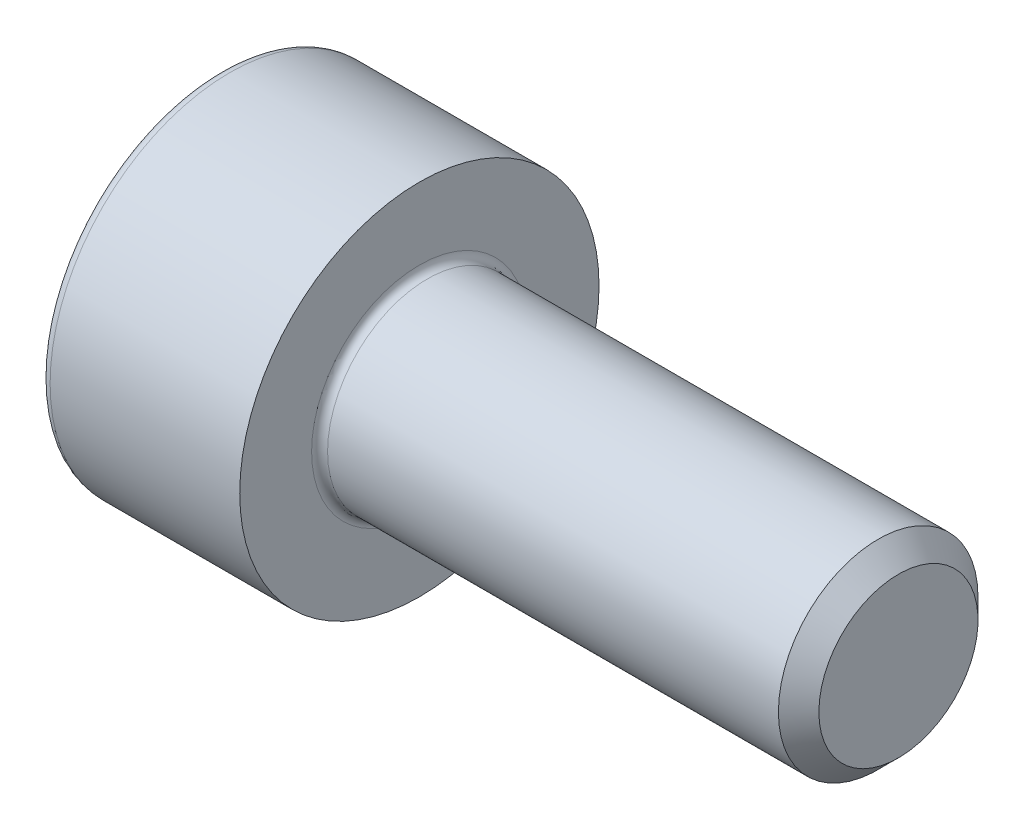
ISO-10303-21;
HEADER;
FILE_DESCRIPTION(('STEP AP214'),'2;1');
FILE_NAME('part.step','',(''),(''),'','','');
FILE_SCHEMA(('AUTOMOTIVE_DESIGN { 1 0 10303 214 1 1 1 1 }'));
ENDSEC;
DATA;
#1=APPLICATION_CONTEXT('core data for automotive mechanical design processes');
#2=APPLICATION_PROTOCOL_DEFINITION('international standard','automotive_design',2000,#1);
#3=PRODUCT_CONTEXT('',#1,'mechanical');
#4=PRODUCT('Part','Part','',(#3));
#5=PRODUCT_RELATED_PRODUCT_CATEGORY('part','',(#4));
#6=PRODUCT_DEFINITION_FORMATION('','',#4);
#7=PRODUCT_DEFINITION_CONTEXT('part definition',#1,'design');
#8=PRODUCT_DEFINITION('design','',#6,#7);
#9=PRODUCT_DEFINITION_SHAPE('','',#8);
#10=(LENGTH_UNIT() NAMED_UNIT(*) SI_UNIT(.MILLI.,.METRE.));
#11=(NAMED_UNIT(*) PLANE_ANGLE_UNIT() SI_UNIT($,.RADIAN.));
#12=(NAMED_UNIT(*) SI_UNIT($,.STERADIAN.) SOLID_ANGLE_UNIT());
#13=UNCERTAINTY_MEASURE_WITH_UNIT(LENGTH_MEASURE(1.E-05),#10,'distance_accuracy_value','');
#14=(GEOMETRIC_REPRESENTATION_CONTEXT(3) GLOBAL_UNCERTAINTY_ASSIGNED_CONTEXT((#13)) GLOBAL_UNIT_ASSIGNED_CONTEXT((#10,
#11,#12)) REPRESENTATION_CONTEXT('',''));
#15=CARTESIAN_POINT('',(0.,0.,0.));
#16=DIRECTION('',(0.,0.,1.));
#17=DIRECTION('',(1.,0.,0.));
#18=AXIS2_PLACEMENT_3D('',#15,#16,#17);
#19=CARTESIAN_POINT('',(0.,0.,0.));
#20=DIRECTION('',(-1.,0.,0.));
#21=DIRECTION('',(0.,0.,1.));
#22=AXIS2_PLACEMENT_3D('',#19,#20,#21);
#23=PLANE('',#22);
#24=DIRECTION('',(0.,-0.499999999999999,0.866025403784439));
#25=VECTOR('',#24,1.);
#26=CARTESIAN_POINT('',(0.,1.18068130049278,0.));
#27=LINE('',#26,#25);
#28=CARTESIAN_POINT('',(0.,1.18068130049278,0.));
#29=VERTEX_POINT('',#28);
#30=CARTESIAN_POINT('',(0.,0.590340650246389,1.0225));
#31=VERTEX_POINT('',#30);
#32=EDGE_CURVE('E373',#29,#31,#27,.T.);
#33=ORIENTED_EDGE('',*,*,#32,.T.);
#34=DIRECTION('',(0.,1.,0.));
#35=VECTOR('',#34,1.);
#36=CARTESIAN_POINT('',(0.,-0.590340650246395,1.0225));
#37=LINE('',#36,#35);
#38=CARTESIAN_POINT('',(0.,-0.590340650246395,1.0225));
#39=VERTEX_POINT('',#38);
#40=EDGE_CURVE('E130',#39,#31,#37,.T.);
#41=ORIENTED_EDGE('',*,*,#40,.F.);
#42=DIRECTION('',(0.,-0.500000000000001,-0.866025403784438));
#43=VECTOR('',#42,1.);
#44=CARTESIAN_POINT('',(0.,-0.590340650246395,1.0225));
#45=LINE('',#44,#43);
#46=CARTESIAN_POINT('',(0.,-1.18068130049279,0.));
#47=VERTEX_POINT('',#46);
#48=EDGE_CURVE('E376',#39,#47,#45,.T.);
#49=ORIENTED_EDGE('',*,*,#48,.T.);
#50=DIRECTION('',(0.,0.499999999999999,-0.866025403784439));
#51=VECTOR('',#50,1.);
#52=CARTESIAN_POINT('',(0.,-1.18068130049279,0.));
#53=LINE('',#52,#51);
#54=CARTESIAN_POINT('',(0.,-0.590340650246397,-1.0225));
#55=VERTEX_POINT('',#54);
#56=EDGE_CURVE('E379',#47,#55,#53,.T.);
#57=ORIENTED_EDGE('',*,*,#56,.T.);
#58=DIRECTION('',(0.,-1.,0.));
#59=VECTOR('',#58,1.);
#60=CARTESIAN_POINT('',(0.,0.590340650246387,-1.0225));
#61=LINE('',#60,#59);
#62=CARTESIAN_POINT('',(0.,0.590340650246387,-1.0225));
#63=VERTEX_POINT('',#62);
#64=EDGE_CURVE('E382',#63,#55,#61,.T.);
#65=ORIENTED_EDGE('',*,*,#64,.F.);
#66=DIRECTION('',(0.,-0.500000000000001,-0.866025403784438));
#67=VECTOR('',#66,1.);
#68=CARTESIAN_POINT('',(0.,1.18068130049278,0.));
#69=LINE('',#68,#67);
#70=EDGE_CURVE('E125',#29,#63,#69,.T.);
#71=ORIENTED_EDGE('',*,*,#70,.F.);
#72=EDGE_LOOP('',(#33,#41,#49,#57,#65,#71));
#73=FACE_BOUND('',#72,.T.);
#74=CARTESIAN_POINT('',(0.,0.,0.));
#75=DIRECTION('',(-1.,0.,0.));
#76=DIRECTION('',(0.,0.,1.));
#77=AXIS2_PLACEMENT_3D('',#74,#75,#76);
#78=CIRCLE('',#77,2.125);
#79=CARTESIAN_POINT('',(0.,0.,2.125));
#80=VERTEX_POINT('',#79);
#81=EDGE_CURVE('E42',#80,#80,#78,.T.);
#82=ORIENTED_EDGE('',*,*,#81,.T.);
#83=EDGE_LOOP('',(#82));
#84=FACE_BOUND('',#83,.T.);
#85=ADVANCED_FACE('F34',(#73,#84),#23,.T.);
#86=CARTESIAN_POINT('',(8.5,0.9965,0.));
#87=DIRECTION('',(1.,0.,0.));
#88=DIRECTION('',(0.,0.,-1.));
#89=AXIS2_PLACEMENT_3D('',#86,#87,#88);
#90=PLANE('',#89);
#91=CARTESIAN_POINT('',(8.5,0.,0.));
#92=DIRECTION('',(-1.,0.,0.));
#93=DIRECTION('',(0.,0.,1.));
#94=AXIS2_PLACEMENT_3D('',#91,#92,#93);
#95=CIRCLE('',#94,0.9965);
#96=CARTESIAN_POINT('',(8.5,0.,0.9965));
#97=VERTEX_POINT('',#96);
#98=EDGE_CURVE('E148',#97,#97,#95,.T.);
#99=ORIENTED_EDGE('',*,*,#98,.F.);
#100=EDGE_LOOP('',(#99));
#101=FACE_BOUND('',#100,.T.);
#102=ADVANCED_FACE('F172',(#101),#90,.T.);
#103=CARTESIAN_POINT('',(8.5,0.,0.));
#104=DIRECTION('',(-1.,0.,0.));
#105=DIRECTION('',(0.,0.,1.));
#106=AXIS2_PLACEMENT_3D('',#103,#104,#105);
#107=CONICAL_SURFACE('',#106,0.9965,0.78539816339747);
#108=CARTESIAN_POINT('',(8.24650000000001,0.,0.));
#109=DIRECTION('',(-1.,0.,0.));
#110=DIRECTION('',(0.,0.,1.));
#111=AXIS2_PLACEMENT_3D('',#108,#109,#110);
#112=CIRCLE('',#111,1.25);
#113=CARTESIAN_POINT('',(8.24650000000001,0.,1.25));
#114=VERTEX_POINT('',#113);
#115=EDGE_CURVE('E145',#114,#114,#112,.T.);
#116=ORIENTED_EDGE('',*,*,#115,.F.);
#117=EDGE_LOOP('',(#116));
#118=FACE_BOUND('',#117,.T.);
#119=ORIENTED_EDGE('',*,*,#98,.T.);
#120=EDGE_LOOP('',(#119));
#121=FACE_BOUND('',#120,.T.);
#122=ADVANCED_FACE('F178',(#118,#121),#107,.T.);
#123=CARTESIAN_POINT('',(-31.75,0.,0.));
#124=DIRECTION('',(-1.,0.,0.));
#125=DIRECTION('',(0.,0.,1.));
#126=AXIS2_PLACEMENT_3D('',#123,#124,#125);
#127=CYLINDRICAL_SURFACE('',#126,1.25);
#128=CARTESIAN_POINT('',(2.6,0.,0.));
#129=DIRECTION('',(1.,0.,0.));
#130=DIRECTION('',(0.,0.,-1.));
#131=AXIS2_PLACEMENT_3D('',#128,#129,#130);
#132=CIRCLE('',#131,1.25);
#133=CARTESIAN_POINT('',(2.6,0.,-1.25));
#134=VERTEX_POINT('',#133);
#135=EDGE_CURVE('E154',#134,#134,#132,.T.);
#136=ORIENTED_EDGE('',*,*,#135,.T.);
#137=EDGE_LOOP('',(#136));
#138=FACE_BOUND('',#137,.T.);
#139=ORIENTED_EDGE('',*,*,#115,.T.);
#140=EDGE_LOOP('',(#139));
#141=FACE_BOUND('',#140,.T.);
#142=ADVANCED_FACE('F190',(#138,#141),#127,.T.);
#143=CARTESIAN_POINT('',(2.5,2.25,0.));
#144=DIRECTION('',(1.,0.,0.));
#145=DIRECTION('',(0.,0.,-1.));
#146=AXIS2_PLACEMENT_3D('',#143,#144,#145);
#147=PLANE('',#146);
#148=CARTESIAN_POINT('',(2.5,0.,0.));
#149=DIRECTION('',(1.,0.,0.));
#150=DIRECTION('',(0.,0.,-1.));
#151=AXIS2_PLACEMENT_3D('',#148,#149,#150);
#152=CIRCLE('',#151,1.35);
#153=CARTESIAN_POINT('',(2.5,0.,-1.35));
#154=VERTEX_POINT('',#153);
#155=EDGE_CURVE('E151',#154,#154,#152,.F.);
#156=ORIENTED_EDGE('',*,*,#155,.T.);
#157=EDGE_LOOP('',(#156));
#158=FACE_BOUND('',#157,.T.);
#159=CARTESIAN_POINT('',(2.5,0.,0.));
#160=DIRECTION('',(-1.,0.,0.));
#161=DIRECTION('',(0.,0.,1.));
#162=AXIS2_PLACEMENT_3D('',#159,#160,#161);
#163=CIRCLE('',#162,2.25);
#164=CARTESIAN_POINT('',(2.5,0.,2.25));
#165=VERTEX_POINT('',#164);
#166=EDGE_CURVE('E141',#165,#165,#163,.T.);
#167=ORIENTED_EDGE('',*,*,#166,.F.);
#168=EDGE_LOOP('',(#167));
#169=FACE_BOUND('',#168,.T.);
#170=ADVANCED_FACE('F186',(#158,#169),#147,.T.);
#171=CARTESIAN_POINT('',(-31.75,0.,0.));
#172=DIRECTION('',(-1.,0.,0.));
#173=DIRECTION('',(0.,0.,1.));
#174=AXIS2_PLACEMENT_3D('',#171,#172,#173);
#175=CYLINDRICAL_SURFACE('',#174,2.25);
#176=CARTESIAN_POINT('',(0.125,0.,0.));
#177=DIRECTION('',(-1.,0.,0.));
#178=DIRECTION('',(0.,0.,1.));
#179=AXIS2_PLACEMENT_3D('',#176,#177,#178);
#180=CIRCLE('',#179,2.25);
#181=CARTESIAN_POINT('',(0.125,0.,2.25));
#182=VERTEX_POINT('',#181);
#183=EDGE_CURVE('E11',#182,#182,#180,.F.);
#184=ORIENTED_EDGE('',*,*,#183,.T.);
#185=EDGE_LOOP('',(#184));
#186=FACE_BOUND('',#185,.T.);
#187=ORIENTED_EDGE('',*,*,#166,.T.);
#188=EDGE_LOOP('',(#187));
#189=FACE_BOUND('',#188,.T.);
#190=ADVANCED_FACE('F168',(#186,#189),#175,.T.);
#191=CARTESIAN_POINT('',(2.6,0.,0.));
#192=DIRECTION('',(1.,0.,0.));
#193=DIRECTION('',(0.,0.,-1.));
#194=AXIS2_PLACEMENT_3D('',#191,#192,#193);
#195=TOROIDAL_SURFACE('',#194,1.35,0.1);
#196=ORIENTED_EDGE('',*,*,#135,.F.);
#197=EDGE_LOOP('',(#196));
#198=FACE_BOUND('',#197,.T.);
#199=ORIENTED_EDGE('',*,*,#155,.F.);
#200=EDGE_LOOP('',(#199));
#201=FACE_BOUND('',#200,.T.);
#202=ADVANCED_FACE('F161',(#198,#201),#195,.F.);
#203=CARTESIAN_POINT('',(0.125,0.,0.));
#204=DIRECTION('',(-1.,0.,0.));
#205=DIRECTION('',(0.,0.,1.));
#206=AXIS2_PLACEMENT_3D('',#203,#204,#205);
#207=TOROIDAL_SURFACE('',#206,2.125,0.125);
#208=ORIENTED_EDGE('',*,*,#183,.F.);
#209=EDGE_LOOP('',(#208));
#210=FACE_BOUND('',#209,.T.);
#211=ORIENTED_EDGE('',*,*,#81,.F.);
#212=EDGE_LOOP('',(#211));
#213=FACE_BOUND('',#212,.T.);
#214=ADVANCED_FACE('F36',(#210,#213),#207,.T.);
#215=CARTESIAN_POINT('',(1.1,1.18068130049278,0.));
#216=DIRECTION('',(0.,-0.866025403784439,-0.499999999999999));
#217=DIRECTION('',(0.,0.499999999999999,-0.866025403784439));
#218=AXIS2_PLACEMENT_3D('',#215,#216,#217);
#219=PLANE('',#218);
#220=ORIENTED_EDGE('',*,*,#32,.F.);
#221=DIRECTION('',(-1.,0.,0.));
#222=VECTOR('',#221,1.);
#223=CARTESIAN_POINT('',(1.1,1.18068130049278,0.));
#224=LINE('',#223,#222);
#225=CARTESIAN_POINT('',(1.1,1.18068130049278,0.));
#226=VERTEX_POINT('',#225);
#227=EDGE_CURVE('E363',#226,#29,#224,.T.);
#228=ORIENTED_EDGE('',*,*,#227,.F.);
#229=DIRECTION('',(0.,-0.499999999999999,0.866025403784439));
#230=VECTOR('',#229,1.);
#231=CARTESIAN_POINT('',(1.1,1.18068130049278,0.));
#232=LINE('',#231,#230);
#233=CARTESIAN_POINT('',(1.1,0.885510975369585,0.511249999999997));
#234=VERTEX_POINT('',#233);
#235=EDGE_CURVE('E117',#226,#234,#232,.T.);
#236=ORIENTED_EDGE('',*,*,#235,.T.);
#237=CARTESIAN_POINT('',(1.1,0.590340650246389,1.0225));
#238=VERTEX_POINT('',#237);
#239=EDGE_CURVE('E108',#234,#238,#232,.T.);
#240=ORIENTED_EDGE('',*,*,#239,.T.);
#241=DIRECTION('',(-1.,0.,0.));
#242=VECTOR('',#241,1.);
#243=CARTESIAN_POINT('',(1.1,0.590340650246389,1.0225));
#244=LINE('',#243,#242);
#245=EDGE_CURVE('E122',#238,#31,#244,.T.);
#246=ORIENTED_EDGE('',*,*,#245,.T.);
#247=EDGE_LOOP('',(#220,#228,#236,#240,#246));
#248=FACE_BOUND('',#247,.T.);
#249=ADVANCED_FACE('F121',(#248),#219,.T.);
#250=CARTESIAN_POINT('',(1.1,-0.590340650246395,1.0225));
#251=DIRECTION('',(0.,0.,1.));
#252=DIRECTION('',(0.,-1.,0.));
#253=AXIS2_PLACEMENT_3D('',#250,#251,#252);
#254=PLANE('',#253);
#255=ORIENTED_EDGE('',*,*,#40,.T.);
#256=ORIENTED_EDGE('',*,*,#245,.F.);
#257=DIRECTION('',(0.,1.,0.));
#258=VECTOR('',#257,1.);
#259=CARTESIAN_POINT('',(1.1,-0.590340650246395,1.0225));
#260=LINE('',#259,#258);
#261=CARTESIAN_POINT('',(1.1,0.,1.0225));
#262=VERTEX_POINT('',#261);
#263=EDGE_CURVE('E105',#262,#238,#260,.T.);
#264=ORIENTED_EDGE('',*,*,#263,.F.);
#265=CARTESIAN_POINT('',(1.1,-0.590340650246395,1.0225));
#266=VERTEX_POINT('',#265);
#267=EDGE_CURVE('E116',#266,#262,#260,.T.);
#268=ORIENTED_EDGE('',*,*,#267,.F.);
#269=DIRECTION('',(-1.,0.,0.));
#270=VECTOR('',#269,1.);
#271=CARTESIAN_POINT('',(1.1,-0.590340650246395,1.0225));
#272=LINE('',#271,#270);
#273=EDGE_CURVE('E132',#266,#39,#272,.T.);
#274=ORIENTED_EDGE('',*,*,#273,.T.);
#275=EDGE_LOOP('',(#255,#256,#264,#268,#274));
#276=FACE_BOUND('',#275,.T.);
#277=ADVANCED_FACE('F127',(#276),#254,.F.);
#278=CARTESIAN_POINT('',(1.1,-0.590340650246395,1.0225));
#279=DIRECTION('',(0.,0.866025403784438,-0.500000000000001));
#280=DIRECTION('',(0.,0.500000000000001,0.866025403784438));
#281=AXIS2_PLACEMENT_3D('',#278,#279,#280);
#282=PLANE('',#281);
#283=ORIENTED_EDGE('',*,*,#48,.F.);
#284=ORIENTED_EDGE('',*,*,#273,.F.);
#285=DIRECTION('',(0.,-0.500000000000001,-0.866025403784438));
#286=VECTOR('',#285,1.);
#287=CARTESIAN_POINT('',(1.1,-0.590340650246395,1.0225));
#288=LINE('',#287,#286);
#289=CARTESIAN_POINT('',(1.1,-0.88551097536959,0.511250000000002));
#290=VERTEX_POINT('',#289);
#291=EDGE_CURVE('E402',#266,#290,#288,.T.);
#292=ORIENTED_EDGE('',*,*,#291,.T.);
#293=CARTESIAN_POINT('',(1.1,-1.18068130049279,0.));
#294=VERTEX_POINT('',#293);
#295=EDGE_CURVE('E391',#290,#294,#288,.T.);
#296=ORIENTED_EDGE('',*,*,#295,.T.);
#297=DIRECTION('',(-1.,0.,0.));
#298=VECTOR('',#297,1.);
#299=CARTESIAN_POINT('',(1.1,-1.18068130049279,0.));
#300=LINE('',#299,#298);
#301=EDGE_CURVE('E137',#294,#47,#300,.T.);
#302=ORIENTED_EDGE('',*,*,#301,.T.);
#303=EDGE_LOOP('',(#283,#284,#292,#296,#302));
#304=FACE_BOUND('',#303,.T.);
#305=ADVANCED_FACE('F254',(#304),#282,.T.);
#306=CARTESIAN_POINT('',(1.1,-1.18068130049279,0.));
#307=DIRECTION('',(0.,0.866025403784439,0.499999999999999));
#308=DIRECTION('',(0.,-0.499999999999999,0.866025403784439));
#309=AXIS2_PLACEMENT_3D('',#306,#307,#308);
#310=PLANE('',#309);
#311=ORIENTED_EDGE('',*,*,#56,.F.);
#312=ORIENTED_EDGE('',*,*,#301,.F.);
#313=DIRECTION('',(0.,0.499999999999999,-0.866025403784439));
#314=VECTOR('',#313,1.);
#315=CARTESIAN_POINT('',(1.1,-1.18068130049279,0.));
#316=LINE('',#315,#314);
#317=CARTESIAN_POINT('',(1.1,-0.885510975369593,-0.511250000000001));
#318=VERTEX_POINT('',#317);
#319=EDGE_CURVE('E369',#294,#318,#316,.T.);
#320=ORIENTED_EDGE('',*,*,#319,.T.);
#321=CARTESIAN_POINT('',(1.1,-0.590340650246397,-1.0225));
#322=VERTEX_POINT('',#321);
#323=EDGE_CURVE('E401',#318,#322,#316,.T.);
#324=ORIENTED_EDGE('',*,*,#323,.T.);
#325=DIRECTION('',(-1.,0.,0.));
#326=VECTOR('',#325,1.);
#327=CARTESIAN_POINT('',(1.1,-0.590340650246397,-1.0225));
#328=LINE('',#327,#326);
#329=EDGE_CURVE('E362',#322,#55,#328,.T.);
#330=ORIENTED_EDGE('',*,*,#329,.T.);
#331=EDGE_LOOP('',(#311,#312,#320,#324,#330));
#332=FACE_BOUND('',#331,.T.);
#333=ADVANCED_FACE('F262',(#332),#310,.T.);
#334=CARTESIAN_POINT('',(1.1,0.590340650246387,-1.0225));
#335=DIRECTION('',(0.,0.,-1.));
#336=DIRECTION('',(0.,1.,0.));
#337=AXIS2_PLACEMENT_3D('',#334,#335,#336);
#338=PLANE('',#337);
#339=ORIENTED_EDGE('',*,*,#64,.T.);
#340=ORIENTED_EDGE('',*,*,#329,.F.);
#341=DIRECTION('',(0.,-1.,0.));
#342=VECTOR('',#341,1.);
#343=CARTESIAN_POINT('',(1.1,0.590340650246387,-1.0225));
#344=LINE('',#343,#342);
#345=CARTESIAN_POINT('',(1.1,0.,-1.0225));
#346=VERTEX_POINT('',#345);
#347=EDGE_CURVE('E366',#346,#322,#344,.T.);
#348=ORIENTED_EDGE('',*,*,#347,.F.);
#349=CARTESIAN_POINT('',(1.1,0.590340650246387,-1.0225));
#350=VERTEX_POINT('',#349);
#351=EDGE_CURVE('E49',#350,#346,#344,.T.);
#352=ORIENTED_EDGE('',*,*,#351,.F.);
#353=DIRECTION('',(-1.,0.,0.));
#354=VECTOR('',#353,1.);
#355=CARTESIAN_POINT('',(1.1,0.590340650246387,-1.0225));
#356=LINE('',#355,#354);
#357=EDGE_CURVE('E359',#350,#63,#356,.T.);
#358=ORIENTED_EDGE('',*,*,#357,.T.);
#359=EDGE_LOOP('',(#339,#340,#348,#352,#358));
#360=FACE_BOUND('',#359,.T.);
#361=ADVANCED_FACE('F271',(#360),#338,.F.);
#362=CARTESIAN_POINT('',(1.1,1.18068130049278,0.));
#363=DIRECTION('',(0.,0.866025403784438,-0.500000000000001));
#364=DIRECTION('',(0.,0.500000000000001,0.866025403784438));
#365=AXIS2_PLACEMENT_3D('',#362,#363,#364);
#366=PLANE('',#365);
#367=ORIENTED_EDGE('',*,*,#70,.T.);
#368=ORIENTED_EDGE('',*,*,#357,.F.);
#369=DIRECTION('',(0.,-0.500000000000001,-0.866025403784438));
#370=VECTOR('',#369,1.);
#371=CARTESIAN_POINT('',(1.1,1.18068130049278,0.));
#372=LINE('',#371,#370);
#373=CARTESIAN_POINT('',(1.1,0.885510975369586,-0.51125));
#374=VERTEX_POINT('',#373);
#375=EDGE_CURVE('E349',#374,#350,#372,.T.);
#376=ORIENTED_EDGE('',*,*,#375,.F.);
#377=EDGE_CURVE('E355',#226,#374,#372,.T.);
#378=ORIENTED_EDGE('',*,*,#377,.F.);
#379=ORIENTED_EDGE('',*,*,#227,.T.);
#380=EDGE_LOOP('',(#367,#368,#376,#378,#379));
#381=FACE_BOUND('',#380,.T.);
#382=ADVANCED_FACE('F280',(#381),#366,.F.);
#383=CARTESIAN_POINT('',(1.1,0.,2.045));
#384=DIRECTION('',(1.,0.,0.));
#385=DIRECTION('',(0.,0.,-1.));
#386=AXIS2_PLACEMENT_3D('',#383,#384,#385);
#387=PLANE('',#386);
#388=ORIENTED_EDGE('',*,*,#347,.T.);
#389=ORIENTED_EDGE('',*,*,#323,.F.);
#390=CARTESIAN_POINT('',(1.1,0.,0.));
#391=DIRECTION('',(-1.,0.,0.));
#392=DIRECTION('',(0.,0.,1.));
#393=AXIS2_PLACEMENT_3D('',#390,#391,#392);
#394=CIRCLE('',#393,1.0225);
#395=EDGE_CURVE('E397',#346,#318,#394,.T.);
#396=ORIENTED_EDGE('',*,*,#395,.F.);
#397=EDGE_LOOP('',(#388,#389,#396));
#398=FACE_BOUND('',#397,.T.);
#399=ADVANCED_FACE('F289',(#398),#387,.F.);
#400=ORIENTED_EDGE('',*,*,#319,.F.);
#401=ORIENTED_EDGE('',*,*,#295,.F.);
#402=EDGE_CURVE('E135',#318,#290,#394,.T.);
#403=ORIENTED_EDGE('',*,*,#402,.F.);
#404=EDGE_LOOP('',(#400,#401,#403));
#405=FACE_BOUND('',#404,.T.);
#406=ADVANCED_FACE('F298',(#405),#387,.F.);
#407=ORIENTED_EDGE('',*,*,#291,.F.);
#408=ORIENTED_EDGE('',*,*,#267,.T.);
#409=EDGE_CURVE('E131',#290,#262,#394,.T.);
#410=ORIENTED_EDGE('',*,*,#409,.F.);
#411=EDGE_LOOP('',(#407,#408,#410));
#412=FACE_BOUND('',#411,.T.);
#413=ADVANCED_FACE('F307',(#412),#387,.F.);
#414=ORIENTED_EDGE('',*,*,#263,.T.);
#415=ORIENTED_EDGE('',*,*,#239,.F.);
#416=EDGE_CURVE('E111',#262,#234,#394,.T.);
#417=ORIENTED_EDGE('',*,*,#416,.F.);
#418=EDGE_LOOP('',(#414,#415,#417));
#419=FACE_BOUND('',#418,.T.);
#420=ADVANCED_FACE('F107',(#419),#387,.F.);
#421=ORIENTED_EDGE('',*,*,#235,.F.);
#422=ORIENTED_EDGE('',*,*,#377,.T.);
#423=EDGE_CURVE('E142',#234,#374,#394,.T.);
#424=ORIENTED_EDGE('',*,*,#423,.F.);
#425=EDGE_LOOP('',(#421,#422,#424));
#426=FACE_BOUND('',#425,.T.);
#427=ADVANCED_FACE('F322',(#426),#387,.F.);
#428=ORIENTED_EDGE('',*,*,#375,.T.);
#429=ORIENTED_EDGE('',*,*,#351,.T.);
#430=EDGE_CURVE('E352',#374,#346,#394,.T.);
#431=ORIENTED_EDGE('',*,*,#430,.F.);
#432=EDGE_LOOP('',(#428,#429,#431));
#433=FACE_BOUND('',#432,.T.);
#434=ADVANCED_FACE('F237',(#433),#387,.F.);
#435=CARTESIAN_POINT('',(1.1,0.,0.));
#436=DIRECTION('',(-1.,0.,0.));
#437=DIRECTION('',(0.,0.,1.));
#438=AXIS2_PLACEMENT_3D('',#435,#436,#437);
#439=CONICAL_SURFACE('',#438,1.0225,1.04719755119659);
#440=CARTESIAN_POINT('',(1.6903406502464,0.,0.));
#441=VERTEX_POINT('',#440);
#442=VERTEX_LOOP('',#441);
#443=FACE_BOUND('',#442,.T.);
#444=ORIENTED_EDGE('',*,*,#416,.T.);
#445=ORIENTED_EDGE('',*,*,#423,.T.);
#446=ORIENTED_EDGE('',*,*,#430,.T.);
#447=ORIENTED_EDGE('',*,*,#395,.T.);
#448=ORIENTED_EDGE('',*,*,#402,.T.);
#449=ORIENTED_EDGE('',*,*,#409,.T.);
#450=EDGE_LOOP('',(#444,#445,#446,#447,#448,#449));
#451=FACE_BOUND('',#450,.T.);
#452=ADVANCED_FACE('F183',(#443,#451),#439,.F.);
#453=CLOSED_SHELL('',(#85,#102,#122,#142,#170,#190,#202,#214,#249,#277,#305,#333,#361,#382,#399,
#406,#413,#420,#427,#434,#452));
#454=MANIFOLD_SOLID_BREP('B2',#453);
#455=ADVANCED_BREP_SHAPE_REPRESENTATION('',(#18,#454),#14);
#456=SHAPE_DEFINITION_REPRESENTATION(#9,#455);
ENDSEC;
END-ISO-10303-21;
